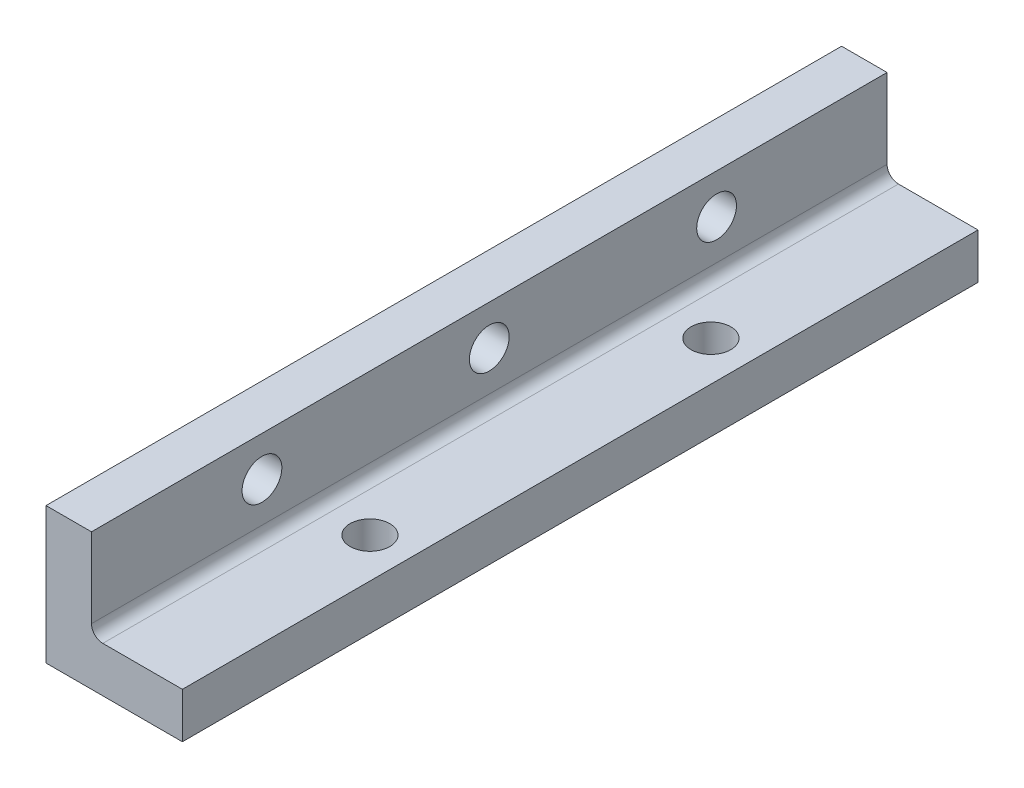
ISO-10303-21;
HEADER;
FILE_DESCRIPTION(('STEP AP214'),'2;1');
FILE_NAME('part.step','',(''),(''),'','','');
FILE_SCHEMA(('AUTOMOTIVE_DESIGN { 1 0 10303 214 1 1 1 1 }'));
ENDSEC;
DATA;
#1=APPLICATION_CONTEXT('core data for automotive mechanical design processes');
#2=APPLICATION_PROTOCOL_DEFINITION('international standard','automotive_design',2000,#1);
#3=PRODUCT_CONTEXT('',#1,'mechanical');
#4=PRODUCT('Part','Part','',(#3));
#5=PRODUCT_RELATED_PRODUCT_CATEGORY('part','',(#4));
#6=PRODUCT_DEFINITION_FORMATION('','',#4);
#7=PRODUCT_DEFINITION_CONTEXT('part definition',#1,'design');
#8=PRODUCT_DEFINITION('design','',#6,#7);
#9=PRODUCT_DEFINITION_SHAPE('','',#8);
#10=(LENGTH_UNIT() NAMED_UNIT(*) SI_UNIT(.MILLI.,.METRE.));
#11=(NAMED_UNIT(*) PLANE_ANGLE_UNIT() SI_UNIT($,.RADIAN.));
#12=(NAMED_UNIT(*) SI_UNIT($,.STERADIAN.) SOLID_ANGLE_UNIT());
#13=UNCERTAINTY_MEASURE_WITH_UNIT(LENGTH_MEASURE(1.E-05),#10,'distance_accuracy_value','');
#14=(GEOMETRIC_REPRESENTATION_CONTEXT(3) GLOBAL_UNCERTAINTY_ASSIGNED_CONTEXT((#13)) GLOBAL_UNIT_ASSIGNED_CONTEXT((#10,
#11,#12)) REPRESENTATION_CONTEXT('',''));
#15=CARTESIAN_POINT('',(0.,0.,0.));
#16=DIRECTION('',(0.,0.,1.));
#17=DIRECTION('',(1.,0.,0.));
#18=AXIS2_PLACEMENT_3D('',#15,#16,#17);
#19=CARTESIAN_POINT('',(-7.27202199744673,0.,70.));
#20=DIRECTION('',(1.,0.,0.));
#21=DIRECTION('',(0.,1.,0.));
#22=AXIS2_PLACEMENT_3D('',#19,#20,#21);
#23=PLANE('',#22);
#24=CARTESIAN_POINT('',(-7.27202199744673,1.95588235294117,15.));
#25=DIRECTION('',(1.,0.,0.));
#26=DIRECTION('',(0.,1.,0.));
#27=AXIS2_PLACEMENT_3D('',#24,#25,#26);
#28=CIRCLE('',#27,1.75);
#29=CARTESIAN_POINT('',(-7.27202199744673,3.70588235294118,15.));
#30=VERTEX_POINT('',#29);
#31=EDGE_CURVE('E156',#30,#30,#28,.T.);
#32=ORIENTED_EDGE('',*,*,#31,.T.);
#33=EDGE_LOOP('',(#32));
#34=FACE_BOUND('',#33,.T.);
#35=CARTESIAN_POINT('',(-7.27202199744673,1.95588235294117,35.));
#36=DIRECTION('',(1.,0.,0.));
#37=DIRECTION('',(0.,1.,0.));
#38=AXIS2_PLACEMENT_3D('',#35,#36,#37);
#39=CIRCLE('',#38,1.75);
#40=CARTESIAN_POINT('',(-7.27202199744673,3.70588235294118,35.));
#41=VERTEX_POINT('',#40);
#42=EDGE_CURVE('E159',#41,#41,#39,.T.);
#43=ORIENTED_EDGE('',*,*,#42,.T.);
#44=EDGE_LOOP('',(#43));
#45=FACE_BOUND('',#44,.T.);
#46=CARTESIAN_POINT('',(-7.27202199744673,1.95588235294117,55.));
#47=DIRECTION('',(1.,0.,0.));
#48=DIRECTION('',(0.,1.,0.));
#49=AXIS2_PLACEMENT_3D('',#46,#47,#48);
#50=CIRCLE('',#49,1.75000000000001);
#51=CARTESIAN_POINT('',(-7.27202199744673,3.70588235294118,55.));
#52=VERTEX_POINT('',#51);
#53=EDGE_CURVE('E143',#52,#52,#50,.T.);
#54=ORIENTED_EDGE('',*,*,#53,.T.);
#55=EDGE_LOOP('',(#54));
#56=FACE_BOUND('',#55,.T.);
#57=DIRECTION('',(0.,-1.,0.));
#58=VECTOR('',#57,1.);
#59=CARTESIAN_POINT('',(-7.27202199744673,0.,0.));
#60=LINE('',#59,#58);
#61=CARTESIAN_POINT('',(-7.27202199744673,5.45588235294117,0.));
#62=VERTEX_POINT('',#61);
#63=CARTESIAN_POINT('',(-7.27202199744673,-6.54411764705883,0.));
#64=VERTEX_POINT('',#63);
#65=EDGE_CURVE('E116',#62,#64,#60,.T.);
#66=ORIENTED_EDGE('',*,*,#65,.T.);
#67=DIRECTION('',(0.,0.,-1.));
#68=VECTOR('',#67,1.);
#69=CARTESIAN_POINT('',(-7.27202199744673,-6.54411764705883,70.));
#70=LINE('',#69,#68);
#71=CARTESIAN_POINT('',(-7.27202199744673,-6.54411764705883,70.));
#72=VERTEX_POINT('',#71);
#73=EDGE_CURVE('E96',#72,#64,#70,.T.);
#74=ORIENTED_EDGE('',*,*,#73,.F.);
#75=DIRECTION('',(0.,-1.,0.));
#76=VECTOR('',#75,1.);
#77=CARTESIAN_POINT('',(-7.27202199744673,0.,70.));
#78=LINE('',#77,#76);
#79=CARTESIAN_POINT('',(-7.27202199744673,5.45588235294117,70.));
#80=VERTEX_POINT('',#79);
#81=EDGE_CURVE('E104',#80,#72,#78,.T.);
#82=ORIENTED_EDGE('',*,*,#81,.F.);
#83=DIRECTION('',(0.,0.,-1.));
#84=VECTOR('',#83,1.);
#85=CARTESIAN_POINT('',(-7.27202199744673,5.45588235294117,70.));
#86=LINE('',#85,#84);
#87=EDGE_CURVE('E129',#80,#62,#86,.T.);
#88=ORIENTED_EDGE('',*,*,#87,.T.);
#89=EDGE_LOOP('',(#66,#74,#82,#88));
#90=FACE_BOUND('',#89,.T.);
#91=ADVANCED_FACE('F35',(#34,#45,#56,#90),#23,.F.);
#92=CARTESIAN_POINT('',(0.,-6.54411764705883,70.));
#93=DIRECTION('',(0.,1.,0.));
#94=DIRECTION('',(0.,0.,1.));
#95=AXIS2_PLACEMENT_3D('',#92,#93,#94);
#96=PLANE('',#95);
#97=CARTESIAN_POINT('',(1.22797800255327,-6.54411764705883,50.));
#98=DIRECTION('',(0.,1.,0.));
#99=DIRECTION('',(0.,0.,1.));
#100=AXIS2_PLACEMENT_3D('',#97,#98,#99);
#101=CIRCLE('',#100,1.75);
#102=CARTESIAN_POINT('',(1.22797800255327,-6.54411764705883,51.75));
#103=VERTEX_POINT('',#102);
#104=EDGE_CURVE('E177',#103,#103,#101,.F.);
#105=ORIENTED_EDGE('',*,*,#104,.F.);
#106=EDGE_LOOP('',(#105));
#107=FACE_BOUND('',#106,.T.);
#108=CARTESIAN_POINT('',(1.22797800255327,-6.54411764705883,20.));
#109=DIRECTION('',(0.,1.,0.));
#110=DIRECTION('',(0.,0.,1.));
#111=AXIS2_PLACEMENT_3D('',#108,#109,#110);
#112=CIRCLE('',#111,1.75);
#113=CARTESIAN_POINT('',(1.22797800255327,-6.54411764705883,21.75));
#114=VERTEX_POINT('',#113);
#115=EDGE_CURVE('E166',#114,#114,#112,.F.);
#116=ORIENTED_EDGE('',*,*,#115,.F.);
#117=EDGE_LOOP('',(#116));
#118=FACE_BOUND('',#117,.T.);
#119=DIRECTION('',(1.,0.,0.));
#120=VECTOR('',#119,1.);
#121=CARTESIAN_POINT('',(0.,-6.54411764705883,0.));
#122=LINE('',#121,#120);
#123=CARTESIAN_POINT('',(4.72797800255327,-6.54411764705883,0.));
#124=VERTEX_POINT('',#123);
#125=EDGE_CURVE('E140',#64,#124,#122,.T.);
#126=ORIENTED_EDGE('',*,*,#125,.T.);
#127=DIRECTION('',(0.,0.,-1.));
#128=VECTOR('',#127,1.);
#129=CARTESIAN_POINT('',(4.72797800255327,-6.54411764705883,70.));
#130=LINE('',#129,#128);
#131=CARTESIAN_POINT('',(4.72797800255327,-6.54411764705883,70.));
#132=VERTEX_POINT('',#131);
#133=EDGE_CURVE('E99',#132,#124,#130,.T.);
#134=ORIENTED_EDGE('',*,*,#133,.F.);
#135=DIRECTION('',(1.,0.,0.));
#136=VECTOR('',#135,1.);
#137=CARTESIAN_POINT('',(0.,-6.54411764705883,70.));
#138=LINE('',#137,#136);
#139=EDGE_CURVE('E92',#72,#132,#138,.T.);
#140=ORIENTED_EDGE('',*,*,#139,.F.);
#141=ORIENTED_EDGE('',*,*,#73,.T.);
#142=EDGE_LOOP('',(#126,#134,#140,#141));
#143=FACE_BOUND('',#142,.T.);
#144=ADVANCED_FACE('F94',(#107,#118,#143),#96,.F.);
#145=CARTESIAN_POINT('',(4.72797800255327,0.,70.));
#146=DIRECTION('',(-1.,0.,0.));
#147=DIRECTION('',(0.,0.,1.));
#148=AXIS2_PLACEMENT_3D('',#145,#146,#147);
#149=PLANE('',#148);
#150=DIRECTION('',(0.,1.,0.));
#151=VECTOR('',#150,1.);
#152=CARTESIAN_POINT('',(4.72797800255327,0.,0.));
#153=LINE('',#152,#151);
#154=CARTESIAN_POINT('',(4.72797800255327,-2.54411764705883,0.));
#155=VERTEX_POINT('',#154);
#156=EDGE_CURVE('E137',#124,#155,#153,.T.);
#157=ORIENTED_EDGE('',*,*,#156,.T.);
#158=DIRECTION('',(0.,0.,-1.));
#159=VECTOR('',#158,1.);
#160=CARTESIAN_POINT('',(4.72797800255327,-2.54411764705883,70.));
#161=LINE('',#160,#159);
#162=CARTESIAN_POINT('',(4.72797800255327,-2.54411764705883,70.));
#163=VERTEX_POINT('',#162);
#164=EDGE_CURVE('E121',#163,#155,#161,.T.);
#165=ORIENTED_EDGE('',*,*,#164,.F.);
#166=DIRECTION('',(0.,1.,0.));
#167=VECTOR('',#166,1.);
#168=CARTESIAN_POINT('',(4.72797800255327,0.,70.));
#169=LINE('',#168,#167);
#170=EDGE_CURVE('E103',#132,#163,#169,.T.);
#171=ORIENTED_EDGE('',*,*,#170,.F.);
#172=ORIENTED_EDGE('',*,*,#133,.T.);
#173=EDGE_LOOP('',(#157,#165,#171,#172));
#174=FACE_BOUND('',#173,.T.);
#175=ADVANCED_FACE('F185',(#174),#149,.F.);
#176=CARTESIAN_POINT('',(0.,-2.54411764705883,70.));
#177=DIRECTION('',(0.,1.,0.));
#178=DIRECTION('',(0.,0.,1.));
#179=AXIS2_PLACEMENT_3D('',#176,#177,#178);
#180=PLANE('',#179);
#181=CARTESIAN_POINT('',(1.22797800255327,-2.54411764705883,50.));
#182=DIRECTION('',(0.,1.,0.));
#183=DIRECTION('',(0.,0.,1.));
#184=AXIS2_PLACEMENT_3D('',#181,#182,#183);
#185=CIRCLE('',#184,1.75);
#186=CARTESIAN_POINT('',(1.22797800255327,-2.54411764705883,51.75));
#187=VERTEX_POINT('',#186);
#188=EDGE_CURVE('E174',#187,#187,#185,.T.);
#189=ORIENTED_EDGE('',*,*,#188,.F.);
#190=EDGE_LOOP('',(#189));
#191=FACE_BOUND('',#190,.T.);
#192=CARTESIAN_POINT('',(1.22797800255327,-2.54411764705883,20.));
#193=DIRECTION('',(0.,1.,0.));
#194=DIRECTION('',(0.,0.,1.));
#195=AXIS2_PLACEMENT_3D('',#192,#193,#194);
#196=CIRCLE('',#195,1.75);
#197=CARTESIAN_POINT('',(1.22797800255327,-2.54411764705883,21.75));
#198=VERTEX_POINT('',#197);
#199=EDGE_CURVE('E171',#198,#198,#196,.T.);
#200=ORIENTED_EDGE('',*,*,#199,.F.);
#201=EDGE_LOOP('',(#200));
#202=FACE_BOUND('',#201,.T.);
#203=DIRECTION('',(1.,0.,0.));
#204=VECTOR('',#203,1.);
#205=CARTESIAN_POINT('',(0.,-2.54411764705883,0.));
#206=LINE('',#205,#204);
#207=CARTESIAN_POINT('',(-2.27202199744673,-2.54411764705883,0.));
#208=VERTEX_POINT('',#207);
#209=EDGE_CURVE('E135',#208,#155,#206,.T.);
#210=ORIENTED_EDGE('',*,*,#209,.F.);
#211=DIRECTION('',(0.,0.,-1.));
#212=VECTOR('',#211,1.);
#213=CARTESIAN_POINT('',(-2.27202199744673,-2.54411764705883,70.));
#214=LINE('',#213,#212);
#215=CARTESIAN_POINT('',(-2.27202199744673,-2.54411764705883,70.));
#216=VERTEX_POINT('',#215);
#217=EDGE_CURVE('E50',#208,#216,#214,.F.);
#218=ORIENTED_EDGE('',*,*,#217,.T.);
#219=DIRECTION('',(1.,0.,0.));
#220=VECTOR('',#219,1.);
#221=CARTESIAN_POINT('',(0.,-2.54411764705883,70.));
#222=LINE('',#221,#220);
#223=EDGE_CURVE('E148',#216,#163,#222,.T.);
#224=ORIENTED_EDGE('',*,*,#223,.T.);
#225=ORIENTED_EDGE('',*,*,#164,.T.);
#226=EDGE_LOOP('',(#210,#218,#224,#225));
#227=FACE_BOUND('',#226,.T.);
#228=ADVANCED_FACE('F211',(#191,#202,#227),#180,.T.);
#229=CARTESIAN_POINT('',(-3.27202199744673,0.,70.));
#230=DIRECTION('',(1.,0.,0.));
#231=DIRECTION('',(0.,1.,0.));
#232=AXIS2_PLACEMENT_3D('',#229,#230,#231);
#233=PLANE('',#232);
#234=CARTESIAN_POINT('',(-3.27202199744673,1.95588235294117,15.));
#235=DIRECTION('',(1.,0.,0.));
#236=DIRECTION('',(0.,1.,0.));
#237=AXIS2_PLACEMENT_3D('',#234,#235,#236);
#238=CIRCLE('',#237,1.75);
#239=CARTESIAN_POINT('',(-3.27202199744673,3.70588235294118,15.));
#240=VERTEX_POINT('',#239);
#241=EDGE_CURVE('E162',#240,#240,#238,.T.);
#242=ORIENTED_EDGE('',*,*,#241,.F.);
#243=EDGE_LOOP('',(#242));
#244=FACE_BOUND('',#243,.T.);
#245=CARTESIAN_POINT('',(-3.27202199744673,1.95588235294117,35.));
#246=DIRECTION('',(1.,0.,0.));
#247=DIRECTION('',(0.,1.,0.));
#248=AXIS2_PLACEMENT_3D('',#245,#246,#247);
#249=CIRCLE('',#248,1.75);
#250=CARTESIAN_POINT('',(-3.27202199744673,3.70588235294118,35.));
#251=VERTEX_POINT('',#250);
#252=EDGE_CURVE('E163',#251,#251,#249,.T.);
#253=ORIENTED_EDGE('',*,*,#252,.F.);
#254=EDGE_LOOP('',(#253));
#255=FACE_BOUND('',#254,.T.);
#256=CARTESIAN_POINT('',(-3.27202199744673,1.95588235294117,55.));
#257=DIRECTION('',(1.,0.,0.));
#258=DIRECTION('',(0.,1.,0.));
#259=AXIS2_PLACEMENT_3D('',#256,#257,#258);
#260=CIRCLE('',#259,1.75000000000001);
#261=CARTESIAN_POINT('',(-3.27202199744673,3.70588235294118,55.));
#262=VERTEX_POINT('',#261);
#263=EDGE_CURVE('E153',#262,#262,#260,.T.);
#264=ORIENTED_EDGE('',*,*,#263,.F.);
#265=EDGE_LOOP('',(#264));
#266=FACE_BOUND('',#265,.T.);
#267=DIRECTION('',(0.,-1.,0.));
#268=VECTOR('',#267,1.);
#269=CARTESIAN_POINT('',(-3.27202199744673,0.,70.));
#270=LINE('',#269,#268);
#271=CARTESIAN_POINT('',(-3.27202199744673,5.45588235294117,70.));
#272=VERTEX_POINT('',#271);
#273=CARTESIAN_POINT('',(-3.27202199744673,-1.54411764705883,70.));
#274=VERTEX_POINT('',#273);
#275=EDGE_CURVE('E145',#272,#274,#270,.T.);
#276=ORIENTED_EDGE('',*,*,#275,.T.);
#277=DIRECTION('',(0.,0.,-1.));
#278=VECTOR('',#277,1.);
#279=CARTESIAN_POINT('',(-3.27202199744673,-1.54411764705883,0.));
#280=LINE('',#279,#278);
#281=CARTESIAN_POINT('',(-3.27202199744673,-1.54411764705883,0.));
#282=VERTEX_POINT('',#281);
#283=EDGE_CURVE('E117',#274,#282,#280,.T.);
#284=ORIENTED_EDGE('',*,*,#283,.T.);
#285=DIRECTION('',(0.,-1.,0.));
#286=VECTOR('',#285,1.);
#287=CARTESIAN_POINT('',(-3.27202199744673,0.,0.));
#288=LINE('',#287,#286);
#289=CARTESIAN_POINT('',(-3.27202199744673,5.45588235294117,0.));
#290=VERTEX_POINT('',#289);
#291=EDGE_CURVE('E133',#290,#282,#288,.T.);
#292=ORIENTED_EDGE('',*,*,#291,.F.);
#293=DIRECTION('',(0.,0.,-1.));
#294=VECTOR('',#293,1.);
#295=CARTESIAN_POINT('',(-3.27202199744673,5.45588235294117,70.));
#296=LINE('',#295,#294);
#297=EDGE_CURVE('E127',#272,#290,#296,.T.);
#298=ORIENTED_EDGE('',*,*,#297,.F.);
#299=EDGE_LOOP('',(#276,#284,#292,#298));
#300=FACE_BOUND('',#299,.T.);
#301=ADVANCED_FACE('F215',(#244,#255,#266,#300),#233,.T.);
#302=CARTESIAN_POINT('',(0.,5.45588235294117,70.));
#303=DIRECTION('',(0.,1.,0.));
#304=DIRECTION('',(0.,0.,1.));
#305=AXIS2_PLACEMENT_3D('',#302,#303,#304);
#306=PLANE('',#305);
#307=DIRECTION('',(1.,0.,0.));
#308=VECTOR('',#307,1.);
#309=CARTESIAN_POINT('',(0.,5.45588235294117,0.));
#310=LINE('',#309,#308);
#311=EDGE_CURVE('E113',#62,#290,#310,.T.);
#312=ORIENTED_EDGE('',*,*,#311,.F.);
#313=ORIENTED_EDGE('',*,*,#87,.F.);
#314=DIRECTION('',(1.,0.,0.));
#315=VECTOR('',#314,1.);
#316=CARTESIAN_POINT('',(0.,5.45588235294117,70.));
#317=LINE('',#316,#315);
#318=EDGE_CURVE('E111',#80,#272,#317,.T.);
#319=ORIENTED_EDGE('',*,*,#318,.T.);
#320=ORIENTED_EDGE('',*,*,#297,.T.);
#321=EDGE_LOOP('',(#312,#313,#319,#320));
#322=FACE_BOUND('',#321,.T.);
#323=ADVANCED_FACE('F219',(#322),#306,.T.);
#324=CARTESIAN_POINT('',(0.,0.,70.));
#325=DIRECTION('',(0.,0.,1.));
#326=DIRECTION('',(1.,0.,0.));
#327=AXIS2_PLACEMENT_3D('',#324,#325,#326);
#328=PLANE('',#327);
#329=ORIENTED_EDGE('',*,*,#81,.T.);
#330=ORIENTED_EDGE('',*,*,#139,.T.);
#331=ORIENTED_EDGE('',*,*,#170,.T.);
#332=ORIENTED_EDGE('',*,*,#223,.F.);
#333=CARTESIAN_POINT('',(-2.27202199744673,-1.54411764705883,70.));
#334=DIRECTION('',(0.,0.,1.));
#335=DIRECTION('',(1.,0.,0.));
#336=AXIS2_PLACEMENT_3D('',#333,#334,#335);
#337=CIRCLE('',#336,1.);
#338=EDGE_CURVE('E11',#216,#274,#337,.F.);
#339=ORIENTED_EDGE('',*,*,#338,.T.);
#340=ORIENTED_EDGE('',*,*,#275,.F.);
#341=ORIENTED_EDGE('',*,*,#318,.F.);
#342=EDGE_LOOP('',(#329,#330,#331,#332,#339,#340,#341));
#343=FACE_BOUND('',#342,.T.);
#344=ADVANCED_FACE('F108',(#343),#328,.T.);
#345=CARTESIAN_POINT('',(0.,0.,0.));
#346=DIRECTION('',(0.,0.,1.));
#347=DIRECTION('',(1.,0.,0.));
#348=AXIS2_PLACEMENT_3D('',#345,#346,#347);
#349=PLANE('',#348);
#350=ORIENTED_EDGE('',*,*,#65,.F.);
#351=ORIENTED_EDGE('',*,*,#311,.T.);
#352=ORIENTED_EDGE('',*,*,#291,.T.);
#353=CARTESIAN_POINT('',(-2.27202199744673,-1.54411764705883,0.));
#354=DIRECTION('',(0.,0.,1.));
#355=DIRECTION('',(1.,0.,0.));
#356=AXIS2_PLACEMENT_3D('',#353,#354,#355);
#357=CIRCLE('',#356,1.);
#358=EDGE_CURVE('E43',#282,#208,#357,.T.);
#359=ORIENTED_EDGE('',*,*,#358,.T.);
#360=ORIENTED_EDGE('',*,*,#209,.T.);
#361=ORIENTED_EDGE('',*,*,#156,.F.);
#362=ORIENTED_EDGE('',*,*,#125,.F.);
#363=EDGE_LOOP('',(#350,#351,#352,#359,#360,#361,#362));
#364=FACE_BOUND('',#363,.T.);
#365=ADVANCED_FACE('F224',(#364),#349,.F.);
#366=CARTESIAN_POINT('',(-2.27202199744673,-1.54411764705883,70.));
#367=DIRECTION('',(0.,0.,1.));
#368=DIRECTION('',(1.,0.,0.));
#369=AXIS2_PLACEMENT_3D('',#366,#367,#368);
#370=CYLINDRICAL_SURFACE('',#369,1.);
#371=ORIENTED_EDGE('',*,*,#338,.F.);
#372=ORIENTED_EDGE('',*,*,#217,.F.);
#373=ORIENTED_EDGE('',*,*,#358,.F.);
#374=ORIENTED_EDGE('',*,*,#283,.F.);
#375=EDGE_LOOP('',(#371,#372,#373,#374));
#376=FACE_BOUND('',#375,.T.);
#377=ADVANCED_FACE('F37',(#376),#370,.F.);
#378=CARTESIAN_POINT('',(-73.2720219974467,1.95588235294116,55.));
#379=DIRECTION('',(1.,0.,0.));
#380=DIRECTION('',(0.,1.,0.));
#381=AXIS2_PLACEMENT_3D('',#378,#379,#380);
#382=CYLINDRICAL_SURFACE('',#381,1.75000000000001);
#383=ORIENTED_EDGE('',*,*,#263,.T.);
#384=EDGE_LOOP('',(#383));
#385=FACE_BOUND('',#384,.T.);
#386=ORIENTED_EDGE('',*,*,#53,.F.);
#387=EDGE_LOOP('',(#386));
#388=FACE_BOUND('',#387,.T.);
#389=ADVANCED_FACE('F229',(#385,#388),#382,.F.);
#390=CARTESIAN_POINT('',(-73.2720219974467,1.95588235294116,35.));
#391=DIRECTION('',(1.,0.,0.));
#392=DIRECTION('',(0.,1.,0.));
#393=AXIS2_PLACEMENT_3D('',#390,#391,#392);
#394=CYLINDRICAL_SURFACE('',#393,1.75);
#395=ORIENTED_EDGE('',*,*,#252,.T.);
#396=EDGE_LOOP('',(#395));
#397=FACE_BOUND('',#396,.T.);
#398=ORIENTED_EDGE('',*,*,#42,.F.);
#399=EDGE_LOOP('',(#398));
#400=FACE_BOUND('',#399,.T.);
#401=ADVANCED_FACE('F200',(#397,#400),#394,.F.);
#402=CARTESIAN_POINT('',(-73.2720219974467,1.95588235294116,15.));
#403=DIRECTION('',(1.,0.,0.));
#404=DIRECTION('',(0.,1.,0.));
#405=AXIS2_PLACEMENT_3D('',#402,#403,#404);
#406=CYLINDRICAL_SURFACE('',#405,1.75);
#407=ORIENTED_EDGE('',*,*,#241,.T.);
#408=EDGE_LOOP('',(#407));
#409=FACE_BOUND('',#408,.T.);
#410=ORIENTED_EDGE('',*,*,#31,.F.);
#411=EDGE_LOOP('',(#410));
#412=FACE_BOUND('',#411,.T.);
#413=ADVANCED_FACE('F191',(#409,#412),#406,.F.);
#414=CARTESIAN_POINT('',(1.22797800255327,-6.54511764705883,20.));
#415=DIRECTION('',(0.,1.,0.));
#416=DIRECTION('',(0.,0.,1.));
#417=AXIS2_PLACEMENT_3D('',#414,#415,#416);
#418=CYLINDRICAL_SURFACE('',#417,1.75);
#419=ORIENTED_EDGE('',*,*,#199,.T.);
#420=EDGE_LOOP('',(#419));
#421=FACE_BOUND('',#420,.T.);
#422=ORIENTED_EDGE('',*,*,#115,.T.);
#423=EDGE_LOOP('',(#422));
#424=FACE_BOUND('',#423,.T.);
#425=ADVANCED_FACE('F189',(#421,#424),#418,.F.);
#426=CARTESIAN_POINT('',(1.22797800255327,-6.54511764705883,50.));
#427=DIRECTION('',(0.,1.,0.));
#428=DIRECTION('',(0.,0.,1.));
#429=AXIS2_PLACEMENT_3D('',#426,#427,#428);
#430=CYLINDRICAL_SURFACE('',#429,1.75);
#431=ORIENTED_EDGE('',*,*,#188,.T.);
#432=EDGE_LOOP('',(#431));
#433=FACE_BOUND('',#432,.T.);
#434=ORIENTED_EDGE('',*,*,#104,.T.);
#435=EDGE_LOOP('',(#434));
#436=FACE_BOUND('',#435,.T.);
#437=ADVANCED_FACE('F181',(#433,#436),#430,.F.);
#438=CLOSED_SHELL('',(#91,#144,#175,#228,#301,#323,#344,#365,#377,#389,#401,#413,#425,#437));
#439=MANIFOLD_SOLID_BREP('B2',#438);
#440=ADVANCED_BREP_SHAPE_REPRESENTATION('',(#18,#439),#14);
#441=SHAPE_DEFINITION_REPRESENTATION(#9,#440);
ENDSEC;
END-ISO-10303-21;
